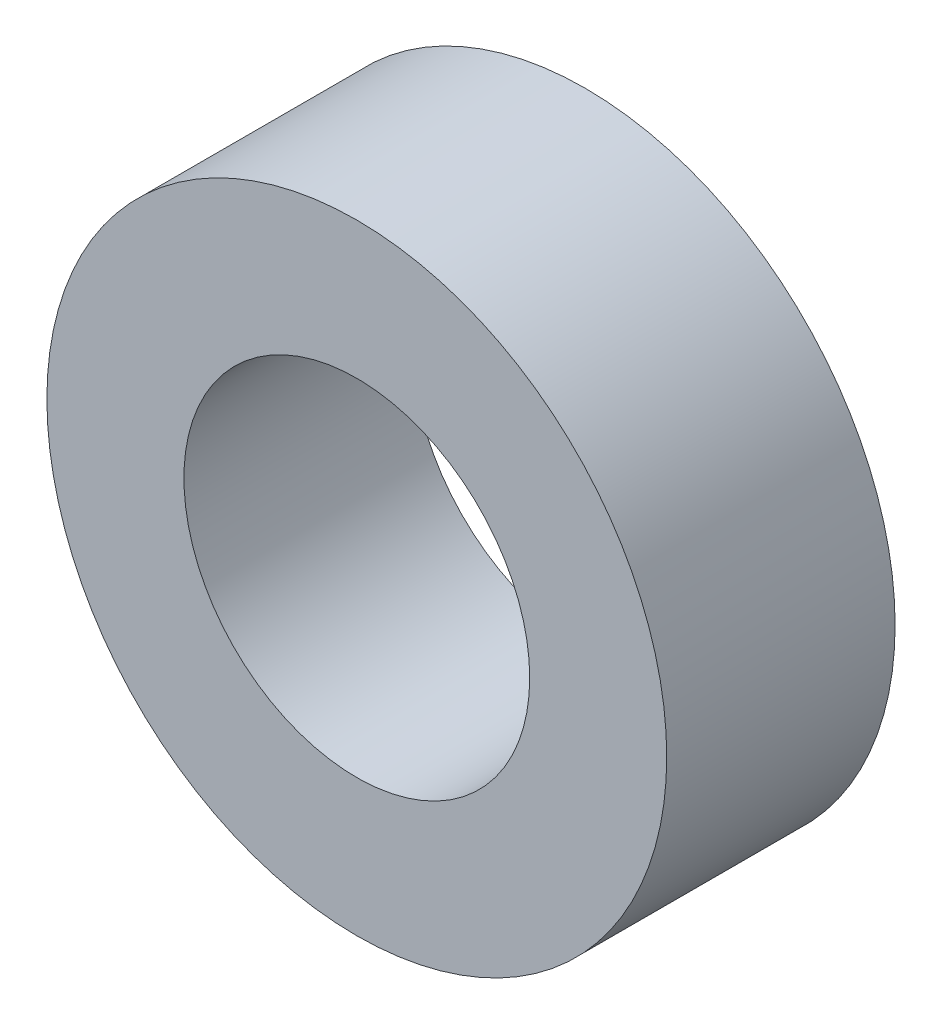
ISO-10303-21;
HEADER;
FILE_DESCRIPTION(('STEP AP214'),'2;1');
FILE_NAME('part.step','',(''),(''),'','','');
FILE_SCHEMA(('AUTOMOTIVE_DESIGN { 1 0 10303 214 1 1 1 1 }'));
ENDSEC;
DATA;
#1=APPLICATION_CONTEXT('core data for automotive mechanical design processes');
#2=APPLICATION_PROTOCOL_DEFINITION('international standard','automotive_design',2000,#1);
#3=PRODUCT_CONTEXT('',#1,'mechanical');
#4=PRODUCT('Part','Part','',(#3));
#5=PRODUCT_RELATED_PRODUCT_CATEGORY('part','',(#4));
#6=PRODUCT_DEFINITION_FORMATION('','',#4);
#7=PRODUCT_DEFINITION_CONTEXT('part definition',#1,'design');
#8=PRODUCT_DEFINITION('design','',#6,#7);
#9=PRODUCT_DEFINITION_SHAPE('','',#8);
#10=(LENGTH_UNIT() NAMED_UNIT(*) SI_UNIT(.MILLI.,.METRE.));
#11=(NAMED_UNIT(*) PLANE_ANGLE_UNIT() SI_UNIT($,.RADIAN.));
#12=(NAMED_UNIT(*) SI_UNIT($,.STERADIAN.) SOLID_ANGLE_UNIT());
#13=UNCERTAINTY_MEASURE_WITH_UNIT(LENGTH_MEASURE(1.E-05),#10,'distance_accuracy_value','');
#14=(GEOMETRIC_REPRESENTATION_CONTEXT(3) GLOBAL_UNCERTAINTY_ASSIGNED_CONTEXT((#13)) GLOBAL_UNIT_ASSIGNED_CONTEXT((#10,
#11,#12)) REPRESENTATION_CONTEXT('',''));
#15=CARTESIAN_POINT('',(0.,0.,0.));
#16=DIRECTION('',(0.,0.,1.));
#17=DIRECTION('',(1.,0.,0.));
#18=AXIS2_PLACEMENT_3D('',#15,#16,#17);
#19=CARTESIAN_POINT('',(0.,0.,7.));
#20=DIRECTION('',(0.,0.,1.));
#21=DIRECTION('',(1.,0.,0.));
#22=AXIS2_PLACEMENT_3D('',#19,#20,#21);
#23=PLANE('',#22);
#24=CARTESIAN_POINT('',(0.,0.,7.));
#25=DIRECTION('',(0.,0.,1.));
#26=DIRECTION('',(1.,0.,0.));
#27=AXIS2_PLACEMENT_3D('',#24,#25,#26);
#28=CIRCLE('',#27,9.5);
#29=CARTESIAN_POINT('',(9.5,0.,7.));
#30=VERTEX_POINT('',#29);
#31=EDGE_CURVE('E10',#30,#30,#28,.T.);
#32=ORIENTED_EDGE('',*,*,#31,.T.);
#33=EDGE_LOOP('',(#32));
#34=FACE_BOUND('',#33,.T.);
#35=CARTESIAN_POINT('',(0.,0.,7.));
#36=DIRECTION('',(0.,0.,1.));
#37=DIRECTION('',(1.,0.,0.));
#38=AXIS2_PLACEMENT_3D('',#35,#36,#37);
#39=CIRCLE('',#38,5.3);
#40=CARTESIAN_POINT('',(5.3,0.,7.));
#41=VERTEX_POINT('',#40);
#42=EDGE_CURVE('E50',#41,#41,#39,.T.);
#43=ORIENTED_EDGE('',*,*,#42,.F.);
#44=EDGE_LOOP('',(#43));
#45=FACE_BOUND('',#44,.T.);
#46=ADVANCED_FACE('F37',(#34,#45),#23,.T.);
#47=CARTESIAN_POINT('',(0.,0.,0.));
#48=DIRECTION('',(0.,0.,1.));
#49=DIRECTION('',(1.,0.,0.));
#50=AXIS2_PLACEMENT_3D('',#47,#48,#49);
#51=PLANE('',#50);
#52=CARTESIAN_POINT('',(0.,0.,0.));
#53=DIRECTION('',(0.,0.,1.));
#54=DIRECTION('',(1.,0.,0.));
#55=AXIS2_PLACEMENT_3D('',#52,#53,#54);
#56=CIRCLE('',#55,9.5);
#57=CARTESIAN_POINT('',(9.5,0.,0.));
#58=VERTEX_POINT('',#57);
#59=EDGE_CURVE('E41',#58,#58,#56,.T.);
#60=ORIENTED_EDGE('',*,*,#59,.F.);
#61=EDGE_LOOP('',(#60));
#62=FACE_BOUND('',#61,.T.);
#63=CARTESIAN_POINT('',(0.,0.,0.));
#64=DIRECTION('',(0.,0.,1.));
#65=DIRECTION('',(1.,0.,0.));
#66=AXIS2_PLACEMENT_3D('',#63,#64,#65);
#67=CIRCLE('',#66,5.3);
#68=CARTESIAN_POINT('',(5.3,0.,0.));
#69=VERTEX_POINT('',#68);
#70=EDGE_CURVE('E52',#69,#69,#67,.T.);
#71=ORIENTED_EDGE('',*,*,#70,.T.);
#72=EDGE_LOOP('',(#71));
#73=FACE_BOUND('',#72,.T.);
#74=ADVANCED_FACE('F64',(#62,#73),#51,.F.);
#75=CARTESIAN_POINT('',(0.,0.,7.));
#76=DIRECTION('',(0.,0.,-1.));
#77=DIRECTION('',(-1.,0.,0.));
#78=AXIS2_PLACEMENT_3D('',#75,#76,#77);
#79=CYLINDRICAL_SURFACE('',#78,9.5);
#80=ORIENTED_EDGE('',*,*,#31,.F.);
#81=EDGE_LOOP('',(#80));
#82=FACE_BOUND('',#81,.T.);
#83=ORIENTED_EDGE('',*,*,#59,.T.);
#84=EDGE_LOOP('',(#83));
#85=FACE_BOUND('',#84,.T.);
#86=ADVANCED_FACE('F39',(#82,#85),#79,.T.);
#87=CARTESIAN_POINT('',(0.,0.,7.));
#88=DIRECTION('',(0.,0.,-1.));
#89=DIRECTION('',(-1.,0.,0.));
#90=AXIS2_PLACEMENT_3D('',#87,#88,#89);
#91=CYLINDRICAL_SURFACE('',#90,5.3);
#92=ORIENTED_EDGE('',*,*,#42,.T.);
#93=EDGE_LOOP('',(#92));
#94=FACE_BOUND('',#93,.T.);
#95=ORIENTED_EDGE('',*,*,#70,.F.);
#96=EDGE_LOOP('',(#95));
#97=FACE_BOUND('',#96,.T.);
#98=ADVANCED_FACE('F60',(#94,#97),#91,.F.);
#99=CLOSED_SHELL('',(#46,#74,#86,#98));
#100=MANIFOLD_SOLID_BREP('B2',#99);
#101=ADVANCED_BREP_SHAPE_REPRESENTATION('',(#18,#100),#14);
#102=SHAPE_DEFINITION_REPRESENTATION(#9,#101);
ENDSEC;
END-ISO-10303-21;
